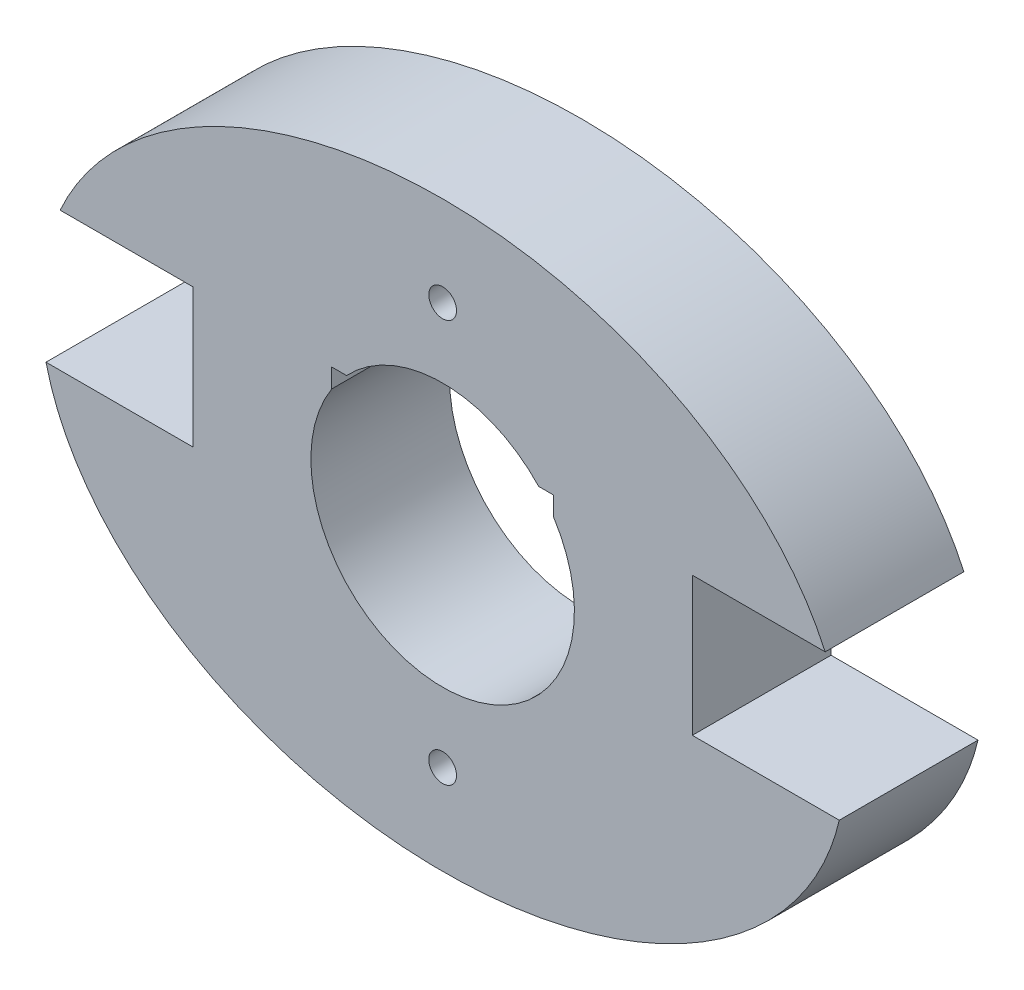
ISO-10303-21;
HEADER;
FILE_DESCRIPTION(('STEP AP214'),'2;1');
FILE_NAME('part.step','',(''),(''),'','','');
FILE_SCHEMA(('AUTOMOTIVE_DESIGN { 1 0 10303 214 1 1 1 1 }'));
ENDSEC;
DATA;
#1=APPLICATION_CONTEXT('core data for automotive mechanical design processes');
#2=APPLICATION_PROTOCOL_DEFINITION('international standard','automotive_design',2000,#1);
#3=PRODUCT_CONTEXT('',#1,'mechanical');
#4=PRODUCT('Part','Part','',(#3));
#5=PRODUCT_RELATED_PRODUCT_CATEGORY('part','',(#4));
#6=PRODUCT_DEFINITION_FORMATION('','',#4);
#7=PRODUCT_DEFINITION_CONTEXT('part definition',#1,'design');
#8=PRODUCT_DEFINITION('design','',#6,#7);
#9=PRODUCT_DEFINITION_SHAPE('','',#8);
#10=(LENGTH_UNIT() NAMED_UNIT(*) SI_UNIT(.MILLI.,.METRE.));
#11=(NAMED_UNIT(*) PLANE_ANGLE_UNIT() SI_UNIT($,.RADIAN.));
#12=(NAMED_UNIT(*) SI_UNIT($,.STERADIAN.) SOLID_ANGLE_UNIT());
#13=UNCERTAINTY_MEASURE_WITH_UNIT(LENGTH_MEASURE(1.E-05),#10,'distance_accuracy_value','');
#14=(GEOMETRIC_REPRESENTATION_CONTEXT(3) GLOBAL_UNCERTAINTY_ASSIGNED_CONTEXT((#13)) GLOBAL_UNIT_ASSIGNED_CONTEXT((#10,
#11,#12)) REPRESENTATION_CONTEXT('',''));
#15=CARTESIAN_POINT('',(0.,0.,0.));
#16=DIRECTION('',(0.,0.,1.));
#17=DIRECTION('',(1.,0.,0.));
#18=AXIS2_PLACEMENT_3D('',#15,#16,#17);
#19=CARTESIAN_POINT('',(0.,0.,5.));
#20=DIRECTION('',(0.,0.,-1.));
#21=DIRECTION('',(-1.,0.,0.));
#22=AXIS2_PLACEMENT_3D('',#19,#20,#21);
#23=CYLINDRICAL_SURFACE('',#22,4.75000000000001);
#24=DIRECTION('',(0.,0.,-1.));
#25=VECTOR('',#24,1.);
#26=CARTESIAN_POINT('',(3.46410161513778,3.25,5.));
#27=LINE('',#26,#25);
#28=CARTESIAN_POINT('',(3.46410161513778,3.25,5.));
#29=VERTEX_POINT('',#28);
#30=CARTESIAN_POINT('',(3.46410161513778,3.25,0.));
#31=VERTEX_POINT('',#30);
#32=EDGE_CURVE('E11',#29,#31,#27,.T.);
#33=ORIENTED_EDGE('',*,*,#32,.F.);
#34=CARTESIAN_POINT('',(0.,0.,5.));
#35=DIRECTION('',(0.,0.,1.));
#36=DIRECTION('',(1.,0.,0.));
#37=AXIS2_PLACEMENT_3D('',#34,#35,#36);
#38=CIRCLE('',#37,4.75000000000001);
#39=CARTESIAN_POINT('',(-3.46410161513778,3.25,5.));
#40=VERTEX_POINT('',#39);
#41=EDGE_CURVE('E156',#29,#40,#38,.T.);
#42=ORIENTED_EDGE('',*,*,#41,.T.);
#43=DIRECTION('',(0.,0.,-1.));
#44=VECTOR('',#43,1.);
#45=CARTESIAN_POINT('',(-3.46410161513778,3.25,5.));
#46=LINE('',#45,#44);
#47=CARTESIAN_POINT('',(-3.46410161513778,3.25,0.));
#48=VERTEX_POINT('',#47);
#49=EDGE_CURVE('E42',#48,#40,#46,.F.);
#50=ORIENTED_EDGE('',*,*,#49,.F.);
#51=CARTESIAN_POINT('',(0.,0.,0.));
#52=DIRECTION('',(0.,0.,1.));
#53=DIRECTION('',(1.,0.,0.));
#54=AXIS2_PLACEMENT_3D('',#51,#52,#53);
#55=CIRCLE('',#54,4.75000000000001);
#56=EDGE_CURVE('E170',#31,#48,#55,.T.);
#57=ORIENTED_EDGE('',*,*,#56,.F.);
#58=EDGE_LOOP('',(#33,#42,#50,#57));
#59=FACE_BOUND('',#58,.T.);
#60=ADVANCED_FACE('F33',(#59),#23,.F.);
#61=CARTESIAN_POINT('',(0.,0.,5.));
#62=DIRECTION('',(0.,0.,-1.));
#63=DIRECTION('',(-1.,0.,0.));
#64=AXIS2_PLACEMENT_3D('',#61,#62,#63);
#65=PLANE('',#64);
#66=CARTESIAN_POINT('',(0.,-7.25449999999413,5.));
#67=DIRECTION('',(0.,0.,1.));
#68=DIRECTION('',(1.,0.,0.));
#69=AXIS2_PLACEMENT_3D('',#66,#67,#68);
#70=CIRCLE('',#69,0.499999999997022);
#71=CARTESIAN_POINT('',(0.499999999997022,-7.25449999999413,5.));
#72=VERTEX_POINT('',#71);
#73=EDGE_CURVE('E173',#72,#72,#70,.T.);
#74=ORIENTED_EDGE('',*,*,#73,.F.);
#75=EDGE_LOOP('',(#74));
#76=FACE_BOUND('',#75,.T.);
#77=CARTESIAN_POINT('',(0.,0.,5.));
#78=DIRECTION('',(0.,0.,1.));
#79=DIRECTION('',(1.,0.,0.));
#80=AXIS2_PLACEMENT_3D('',#77,#78,#79);
#81=ELLIPSE('',#80,14.5,10.5);
#82=CARTESIAN_POINT('',(13.7879295448514,3.25,5.));
#83=VERTEX_POINT('',#82);
#84=CARTESIAN_POINT('',(-13.7879295448514,3.25,5.));
#85=VERTEX_POINT('',#84);
#86=EDGE_CURVE('E185',#83,#85,#81,.T.);
#87=ORIENTED_EDGE('',*,*,#86,.T.);
#88=DIRECTION('',(1.,0.,0.));
#89=VECTOR('',#88,1.);
#90=CARTESIAN_POINT('',(-13.7879295448514,3.25,5.));
#91=LINE('',#90,#89);
#92=CARTESIAN_POINT('',(-9.,3.25,5.));
#93=VERTEX_POINT('',#92);
#94=EDGE_CURVE('E189',#85,#93,#91,.T.);
#95=ORIENTED_EDGE('',*,*,#94,.T.);
#96=DIRECTION('',(0.,-1.,0.));
#97=VECTOR('',#96,1.);
#98=CARTESIAN_POINT('',(-9.,3.25,5.));
#99=LINE('',#98,#97);
#100=CARTESIAN_POINT('',(-9.,-1.75000000000001,5.));
#101=VERTEX_POINT('',#100);
#102=EDGE_CURVE('E192',#93,#101,#99,.T.);
#103=ORIENTED_EDGE('',*,*,#102,.T.);
#104=DIRECTION('',(-1.,0.,0.));
#105=VECTOR('',#104,1.);
#106=CARTESIAN_POINT('',(-14.2971928091574,-1.75000000000001,5.));
#107=LINE('',#106,#105);
#108=CARTESIAN_POINT('',(-14.2971928091574,-1.75000000000001,5.));
#109=VERTEX_POINT('',#108);
#110=EDGE_CURVE('E194',#101,#109,#107,.T.);
#111=ORIENTED_EDGE('',*,*,#110,.T.);
#112=CARTESIAN_POINT('',(0.,0.,5.));
#113=DIRECTION('',(0.,0.,1.));
#114=DIRECTION('',(1.,0.,0.));
#115=AXIS2_PLACEMENT_3D('',#112,#113,#114);
#116=ELLIPSE('',#115,14.5,10.5);
#117=CARTESIAN_POINT('',(14.2971928091574,-1.75000000000001,5.));
#118=VERTEX_POINT('',#117);
#119=EDGE_CURVE('E196',#109,#118,#116,.T.);
#120=ORIENTED_EDGE('',*,*,#119,.T.);
#121=DIRECTION('',(-1.,0.,0.));
#122=VECTOR('',#121,1.);
#123=CARTESIAN_POINT('',(14.2971928091574,-1.75000000000001,5.));
#124=LINE('',#123,#122);
#125=CARTESIAN_POINT('',(9.,-1.75,5.));
#126=VERTEX_POINT('',#125);
#127=EDGE_CURVE('E199',#118,#126,#124,.T.);
#128=ORIENTED_EDGE('',*,*,#127,.T.);
#129=DIRECTION('',(0.,1.,0.));
#130=VECTOR('',#129,1.);
#131=CARTESIAN_POINT('',(9.,3.25,5.));
#132=LINE('',#131,#130);
#133=CARTESIAN_POINT('',(9.,3.25,5.));
#134=VERTEX_POINT('',#133);
#135=EDGE_CURVE('E301',#126,#134,#132,.T.);
#136=ORIENTED_EDGE('',*,*,#135,.T.);
#137=DIRECTION('',(1.,0.,0.));
#138=VECTOR('',#137,1.);
#139=CARTESIAN_POINT('',(13.7879295448514,3.25,5.));
#140=LINE('',#139,#138);
#141=EDGE_CURVE('E285',#134,#83,#140,.T.);
#142=ORIENTED_EDGE('',*,*,#141,.T.);
#143=EDGE_LOOP('',(#87,#95,#103,#111,#120,#128,#136,#142));
#144=FACE_BOUND('',#143,.T.);
#145=CARTESIAN_POINT('',(3.11417199942654E-12,7.25450000000587,5.));
#146=DIRECTION('',(0.,0.,1.));
#147=DIRECTION('',(1.,0.,0.));
#148=AXIS2_PLACEMENT_3D('',#145,#146,#147);
#149=CIRCLE('',#148,0.5);
#150=CARTESIAN_POINT('',(0.500000000003114,7.25450000000587,5.));
#151=VERTEX_POINT('',#150);
#152=EDGE_CURVE('E180',#151,#151,#149,.T.);
#153=ORIENTED_EDGE('',*,*,#152,.F.);
#154=EDGE_LOOP('',(#153));
#155=FACE_BOUND('',#154,.T.);
#156=DIRECTION('',(0.,1.,0.));
#157=VECTOR('',#156,1.);
#158=CARTESIAN_POINT('',(-4.,3.25,5.));
#159=LINE('',#158,#157);
#160=CARTESIAN_POINT('',(-4.,2.56173769148993,5.));
#161=VERTEX_POINT('',#160);
#162=CARTESIAN_POINT('',(-4.,3.25,5.));
#163=VERTEX_POINT('',#162);
#164=EDGE_CURVE('E57',#161,#163,#159,.T.);
#165=ORIENTED_EDGE('',*,*,#164,.T.);
#166=DIRECTION('',(1.,0.,0.));
#167=VECTOR('',#166,1.);
#168=CARTESIAN_POINT('',(-4.,3.25,5.));
#169=LINE('',#168,#167);
#170=EDGE_CURVE('E150',#163,#40,#169,.T.);
#171=ORIENTED_EDGE('',*,*,#170,.T.);
#172=ORIENTED_EDGE('',*,*,#41,.F.);
#173=CARTESIAN_POINT('',(4.,3.25,5.));
#174=VERTEX_POINT('',#173);
#175=EDGE_CURVE('E137',#29,#174,#169,.T.);
#176=ORIENTED_EDGE('',*,*,#175,.T.);
#177=DIRECTION('',(0.,-1.,0.));
#178=VECTOR('',#177,1.);
#179=CARTESIAN_POINT('',(4.,3.25,5.));
#180=LINE('',#179,#178);
#181=CARTESIAN_POINT('',(4.,2.56173769148993,5.));
#182=VERTEX_POINT('',#181);
#183=EDGE_CURVE('E144',#174,#182,#180,.T.);
#184=ORIENTED_EDGE('',*,*,#183,.T.);
#185=EDGE_CURVE('E168',#161,#182,#38,.T.);
#186=ORIENTED_EDGE('',*,*,#185,.F.);
#187=EDGE_LOOP('',(#165,#171,#172,#176,#184,#186));
#188=FACE_BOUND('',#187,.T.);
#189=ADVANCED_FACE('F153',(#76,#144,#155,#188),#65,.F.);
#190=CARTESIAN_POINT('',(0.,0.,0.));
#191=DIRECTION('',(0.,0.,-1.));
#192=DIRECTION('',(-1.,0.,0.));
#193=AXIS2_PLACEMENT_3D('',#190,#191,#192);
#194=PLANE('',#193);
#195=DIRECTION('',(1.,0.,0.));
#196=VECTOR('',#195,1.);
#197=CARTESIAN_POINT('',(-4.,3.25,0.));
#198=LINE('',#197,#196);
#199=CARTESIAN_POINT('',(-4.,3.25,0.));
#200=VERTEX_POINT('',#199);
#201=EDGE_CURVE('E162',#200,#48,#198,.T.);
#202=ORIENTED_EDGE('',*,*,#201,.F.);
#203=DIRECTION('',(0.,1.,0.));
#204=VECTOR('',#203,1.);
#205=CARTESIAN_POINT('',(-4.,3.25,0.));
#206=LINE('',#205,#204);
#207=CARTESIAN_POINT('',(-4.,2.56173769148993,0.));
#208=VERTEX_POINT('',#207);
#209=EDGE_CURVE('E157',#208,#200,#206,.T.);
#210=ORIENTED_EDGE('',*,*,#209,.F.);
#211=CARTESIAN_POINT('',(4.,2.56173769148993,0.));
#212=VERTEX_POINT('',#211);
#213=EDGE_CURVE('E166',#208,#212,#55,.T.);
#214=ORIENTED_EDGE('',*,*,#213,.T.);
#215=DIRECTION('',(0.,-1.,0.));
#216=VECTOR('',#215,1.);
#217=CARTESIAN_POINT('',(4.,3.25,0.));
#218=LINE('',#217,#216);
#219=CARTESIAN_POINT('',(4.,3.25,0.));
#220=VERTEX_POINT('',#219);
#221=EDGE_CURVE('E49',#220,#212,#218,.T.);
#222=ORIENTED_EDGE('',*,*,#221,.F.);
#223=EDGE_CURVE('E140',#31,#220,#198,.T.);
#224=ORIENTED_EDGE('',*,*,#223,.F.);
#225=ORIENTED_EDGE('',*,*,#56,.T.);
#226=EDGE_LOOP('',(#202,#210,#214,#222,#224,#225));
#227=FACE_BOUND('',#226,.T.);
#228=CARTESIAN_POINT('',(0.,-7.25449999999413,0.));
#229=DIRECTION('',(0.,0.,1.));
#230=DIRECTION('',(1.,0.,0.));
#231=AXIS2_PLACEMENT_3D('',#228,#229,#230);
#232=CIRCLE('',#231,0.499999999997022);
#233=CARTESIAN_POINT('',(0.499999999997022,-7.25449999999413,0.));
#234=VERTEX_POINT('',#233);
#235=EDGE_CURVE('E177',#234,#234,#232,.T.);
#236=ORIENTED_EDGE('',*,*,#235,.T.);
#237=EDGE_LOOP('',(#236));
#238=FACE_BOUND('',#237,.T.);
#239=CARTESIAN_POINT('',(0.,0.,0.));
#240=DIRECTION('',(0.,0.,1.));
#241=DIRECTION('',(1.,0.,0.));
#242=AXIS2_PLACEMENT_3D('',#239,#240,#241);
#243=ELLIPSE('',#242,14.5,10.5);
#244=CARTESIAN_POINT('',(13.7879295448514,3.25,0.));
#245=VERTEX_POINT('',#244);
#246=CARTESIAN_POINT('',(-13.7879295448514,3.25,0.));
#247=VERTEX_POINT('',#246);
#248=EDGE_CURVE('E183',#245,#247,#243,.T.);
#249=ORIENTED_EDGE('',*,*,#248,.F.);
#250=DIRECTION('',(1.,0.,0.));
#251=VECTOR('',#250,1.);
#252=CARTESIAN_POINT('',(13.7879295448514,3.25,0.));
#253=LINE('',#252,#251);
#254=CARTESIAN_POINT('',(9.,3.25,0.));
#255=VERTEX_POINT('',#254);
#256=EDGE_CURVE('E190',#255,#245,#253,.T.);
#257=ORIENTED_EDGE('',*,*,#256,.F.);
#258=DIRECTION('',(0.,1.,0.));
#259=VECTOR('',#258,1.);
#260=CARTESIAN_POINT('',(9.,3.25,0.));
#261=LINE('',#260,#259);
#262=CARTESIAN_POINT('',(9.,-1.75,0.));
#263=VERTEX_POINT('',#262);
#264=EDGE_CURVE('E287',#263,#255,#261,.T.);
#265=ORIENTED_EDGE('',*,*,#264,.F.);
#266=DIRECTION('',(-1.,0.,0.));
#267=VECTOR('',#266,1.);
#268=CARTESIAN_POINT('',(14.2971928091574,-1.75000000000001,0.));
#269=LINE('',#268,#267);
#270=CARTESIAN_POINT('',(14.2971928091574,-1.75000000000001,0.));
#271=VERTEX_POINT('',#270);
#272=EDGE_CURVE('E289',#271,#263,#269,.T.);
#273=ORIENTED_EDGE('',*,*,#272,.F.);
#274=CARTESIAN_POINT('',(0.,0.,0.));
#275=DIRECTION('',(0.,0.,1.));
#276=DIRECTION('',(1.,0.,0.));
#277=AXIS2_PLACEMENT_3D('',#274,#275,#276);
#278=ELLIPSE('',#277,14.5,10.5);
#279=CARTESIAN_POINT('',(-14.2971928091574,-1.75000000000001,0.));
#280=VERTEX_POINT('',#279);
#281=EDGE_CURVE('E291',#280,#271,#278,.T.);
#282=ORIENTED_EDGE('',*,*,#281,.F.);
#283=DIRECTION('',(-1.,0.,0.));
#284=VECTOR('',#283,1.);
#285=CARTESIAN_POINT('',(-14.2971928091574,-1.75000000000001,0.));
#286=LINE('',#285,#284);
#287=CARTESIAN_POINT('',(-9.,-1.75000000000001,0.));
#288=VERTEX_POINT('',#287);
#289=EDGE_CURVE('E293',#288,#280,#286,.T.);
#290=ORIENTED_EDGE('',*,*,#289,.F.);
#291=DIRECTION('',(0.,-1.,0.));
#292=VECTOR('',#291,1.);
#293=CARTESIAN_POINT('',(-9.,3.25,0.));
#294=LINE('',#293,#292);
#295=CARTESIAN_POINT('',(-9.,3.25,0.));
#296=VERTEX_POINT('',#295);
#297=EDGE_CURVE('E295',#296,#288,#294,.T.);
#298=ORIENTED_EDGE('',*,*,#297,.F.);
#299=DIRECTION('',(1.,0.,0.));
#300=VECTOR('',#299,1.);
#301=CARTESIAN_POINT('',(-13.7879295448514,3.25,0.));
#302=LINE('',#301,#300);
#303=EDGE_CURVE('E297',#247,#296,#302,.T.);
#304=ORIENTED_EDGE('',*,*,#303,.F.);
#305=EDGE_LOOP('',(#249,#257,#265,#273,#282,#290,#298,#304));
#306=FACE_BOUND('',#305,.T.);
#307=CARTESIAN_POINT('',(3.11417199942654E-12,7.25450000000587,0.));
#308=DIRECTION('',(0.,0.,1.));
#309=DIRECTION('',(1.,0.,0.));
#310=AXIS2_PLACEMENT_3D('',#307,#308,#309);
#311=CIRCLE('',#310,0.5);
#312=CARTESIAN_POINT('',(0.500000000003114,7.25450000000587,0.));
#313=VERTEX_POINT('',#312);
#314=EDGE_CURVE('E176',#313,#313,#311,.T.);
#315=ORIENTED_EDGE('',*,*,#314,.T.);
#316=EDGE_LOOP('',(#315));
#317=FACE_BOUND('',#316,.T.);
#318=ADVANCED_FACE('F222',(#227,#238,#306,#317),#194,.T.);
#319=DIRECTION('',(0.,0.,-1.));
#320=VECTOR('',#319,1.);
#321=SURFACE_OF_LINEAR_EXTRUSION('',#81,#320);
#322=ORIENTED_EDGE('',*,*,#248,.T.);
#323=DIRECTION('',(0.,0.,-1.));
#324=VECTOR('',#323,1.);
#325=CARTESIAN_POINT('',(-13.7879295448514,3.25,5.));
#326=LINE('',#325,#324);
#327=EDGE_CURVE('E261',#85,#247,#326,.T.);
#328=ORIENTED_EDGE('',*,*,#327,.F.);
#329=ORIENTED_EDGE('',*,*,#86,.F.);
#330=DIRECTION('',(0.,0.,-1.));
#331=VECTOR('',#330,1.);
#332=CARTESIAN_POINT('',(13.7879295448514,3.25,5.));
#333=LINE('',#332,#331);
#334=EDGE_CURVE('E282',#83,#245,#333,.T.);
#335=ORIENTED_EDGE('',*,*,#334,.T.);
#336=EDGE_LOOP('',(#322,#328,#329,#335));
#337=FACE_BOUND('',#336,.T.);
#338=ADVANCED_FACE('F35',(#337),#321,.F.);
#339=CARTESIAN_POINT('',(-13.7879295448514,3.25,5.));
#340=DIRECTION('',(0.,1.,0.));
#341=DIRECTION('',(-1.,0.,0.));
#342=AXIS2_PLACEMENT_3D('',#339,#340,#341);
#343=PLANE('',#342);
#344=ORIENTED_EDGE('',*,*,#303,.T.);
#345=DIRECTION('',(0.,0.,-1.));
#346=VECTOR('',#345,1.);
#347=CARTESIAN_POINT('',(-9.,3.25,5.));
#348=LINE('',#347,#346);
#349=EDGE_CURVE('E264',#93,#296,#348,.T.);
#350=ORIENTED_EDGE('',*,*,#349,.F.);
#351=ORIENTED_EDGE('',*,*,#94,.F.);
#352=ORIENTED_EDGE('',*,*,#327,.T.);
#353=EDGE_LOOP('',(#344,#350,#351,#352));
#354=FACE_BOUND('',#353,.T.);
#355=ADVANCED_FACE('F215',(#354),#343,.F.);
#356=CARTESIAN_POINT('',(-9.,3.25,5.));
#357=DIRECTION('',(1.,0.,0.));
#358=DIRECTION('',(0.,1.,0.));
#359=AXIS2_PLACEMENT_3D('',#356,#357,#358);
#360=PLANE('',#359);
#361=ORIENTED_EDGE('',*,*,#297,.T.);
#362=DIRECTION('',(0.,0.,-1.));
#363=VECTOR('',#362,1.);
#364=CARTESIAN_POINT('',(-9.,-1.75000000000001,5.));
#365=LINE('',#364,#363);
#366=EDGE_CURVE('E267',#101,#288,#365,.T.);
#367=ORIENTED_EDGE('',*,*,#366,.F.);
#368=ORIENTED_EDGE('',*,*,#102,.F.);
#369=ORIENTED_EDGE('',*,*,#349,.T.);
#370=EDGE_LOOP('',(#361,#367,#368,#369));
#371=FACE_BOUND('',#370,.T.);
#372=ADVANCED_FACE('F212',(#371),#360,.F.);
#373=CARTESIAN_POINT('',(-14.2971928091574,-1.75000000000001,5.));
#374=DIRECTION('',(0.,-1.,0.));
#375=DIRECTION('',(1.,0.,0.));
#376=AXIS2_PLACEMENT_3D('',#373,#374,#375);
#377=PLANE('',#376);
#378=ORIENTED_EDGE('',*,*,#289,.T.);
#379=DIRECTION('',(0.,0.,-1.));
#380=VECTOR('',#379,1.);
#381=CARTESIAN_POINT('',(-14.2971928091574,-1.75000000000001,5.));
#382=LINE('',#381,#380);
#383=EDGE_CURVE('E270',#109,#280,#382,.T.);
#384=ORIENTED_EDGE('',*,*,#383,.F.);
#385=ORIENTED_EDGE('',*,*,#110,.F.);
#386=ORIENTED_EDGE('',*,*,#366,.T.);
#387=EDGE_LOOP('',(#378,#384,#385,#386));
#388=FACE_BOUND('',#387,.T.);
#389=ADVANCED_FACE('F207',(#388),#377,.F.);
#390=DIRECTION('',(0.,0.,-1.));
#391=VECTOR('',#390,1.);
#392=SURFACE_OF_LINEAR_EXTRUSION('',#116,#391);
#393=ORIENTED_EDGE('',*,*,#281,.T.);
#394=DIRECTION('',(0.,0.,-1.));
#395=VECTOR('',#394,1.);
#396=CARTESIAN_POINT('',(14.2971928091574,-1.75000000000001,5.));
#397=LINE('',#396,#395);
#398=EDGE_CURVE('E273',#118,#271,#397,.T.);
#399=ORIENTED_EDGE('',*,*,#398,.F.);
#400=ORIENTED_EDGE('',*,*,#119,.F.);
#401=ORIENTED_EDGE('',*,*,#383,.T.);
#402=EDGE_LOOP('',(#393,#399,#400,#401));
#403=FACE_BOUND('',#402,.T.);
#404=ADVANCED_FACE('F202',(#403),#392,.F.);
#405=CARTESIAN_POINT('',(14.2971928091574,-1.75000000000001,5.));
#406=DIRECTION('',(0.,-1.,0.));
#407=DIRECTION('',(1.,0.,0.));
#408=AXIS2_PLACEMENT_3D('',#405,#406,#407);
#409=PLANE('',#408);
#410=ORIENTED_EDGE('',*,*,#272,.T.);
#411=DIRECTION('',(0.,0.,-1.));
#412=VECTOR('',#411,1.);
#413=CARTESIAN_POINT('',(9.,-1.75,5.));
#414=LINE('',#413,#412);
#415=EDGE_CURVE('E276',#126,#263,#414,.T.);
#416=ORIENTED_EDGE('',*,*,#415,.F.);
#417=ORIENTED_EDGE('',*,*,#127,.F.);
#418=ORIENTED_EDGE('',*,*,#398,.T.);
#419=EDGE_LOOP('',(#410,#416,#417,#418));
#420=FACE_BOUND('',#419,.T.);
#421=ADVANCED_FACE('F206',(#420),#409,.F.);
#422=CARTESIAN_POINT('',(9.,3.25,5.));
#423=DIRECTION('',(-1.,0.,0.));
#424=DIRECTION('',(0.,-1.,0.));
#425=AXIS2_PLACEMENT_3D('',#422,#423,#424);
#426=PLANE('',#425);
#427=ORIENTED_EDGE('',*,*,#264,.T.);
#428=DIRECTION('',(0.,0.,-1.));
#429=VECTOR('',#428,1.);
#430=CARTESIAN_POINT('',(9.,3.25,5.));
#431=LINE('',#430,#429);
#432=EDGE_CURVE('E279',#134,#255,#431,.T.);
#433=ORIENTED_EDGE('',*,*,#432,.F.);
#434=ORIENTED_EDGE('',*,*,#135,.F.);
#435=ORIENTED_EDGE('',*,*,#415,.T.);
#436=EDGE_LOOP('',(#427,#433,#434,#435));
#437=FACE_BOUND('',#436,.T.);
#438=ADVANCED_FACE('F314',(#437),#426,.F.);
#439=CARTESIAN_POINT('',(13.7879295448514,3.25,5.));
#440=DIRECTION('',(0.,1.,0.));
#441=DIRECTION('',(-1.,0.,0.));
#442=AXIS2_PLACEMENT_3D('',#439,#440,#441);
#443=PLANE('',#442);
#444=ORIENTED_EDGE('',*,*,#256,.T.);
#445=ORIENTED_EDGE('',*,*,#334,.F.);
#446=ORIENTED_EDGE('',*,*,#141,.F.);
#447=ORIENTED_EDGE('',*,*,#432,.T.);
#448=EDGE_LOOP('',(#444,#445,#446,#447));
#449=FACE_BOUND('',#448,.T.);
#450=ADVANCED_FACE('F319',(#449),#443,.F.);
#451=CARTESIAN_POINT('',(3.11417199942654E-12,7.25450000000587,5.));
#452=DIRECTION('',(0.,0.,-1.));
#453=DIRECTION('',(-1.,0.,0.));
#454=AXIS2_PLACEMENT_3D('',#451,#452,#453);
#455=CYLINDRICAL_SURFACE('',#454,0.5);
#456=ORIENTED_EDGE('',*,*,#152,.T.);
#457=EDGE_LOOP('',(#456));
#458=FACE_BOUND('',#457,.T.);
#459=ORIENTED_EDGE('',*,*,#314,.F.);
#460=EDGE_LOOP('',(#459));
#461=FACE_BOUND('',#460,.T.);
#462=ADVANCED_FACE('F243',(#458,#461),#455,.F.);
#463=CARTESIAN_POINT('',(0.,-7.25449999999413,5.));
#464=DIRECTION('',(0.,0.,-1.));
#465=DIRECTION('',(-1.,0.,0.));
#466=AXIS2_PLACEMENT_3D('',#463,#464,#465);
#467=CYLINDRICAL_SURFACE('',#466,0.499999999997022);
#468=ORIENTED_EDGE('',*,*,#73,.T.);
#469=EDGE_LOOP('',(#468));
#470=FACE_BOUND('',#469,.T.);
#471=ORIENTED_EDGE('',*,*,#235,.F.);
#472=EDGE_LOOP('',(#471));
#473=FACE_BOUND('',#472,.T.);
#474=ADVANCED_FACE('F236',(#470,#473),#467,.F.);
#475=DIRECTION('',(0.,0.,-1.));
#476=VECTOR('',#475,1.);
#477=CARTESIAN_POINT('',(-4.,2.56173769148993,5.));
#478=LINE('',#477,#476);
#479=EDGE_CURVE('E246',#161,#208,#478,.T.);
#480=ORIENTED_EDGE('',*,*,#479,.F.);
#481=ORIENTED_EDGE('',*,*,#185,.T.);
#482=DIRECTION('',(0.,0.,-1.));
#483=VECTOR('',#482,1.);
#484=CARTESIAN_POINT('',(4.,2.56173769148993,5.));
#485=LINE('',#484,#483);
#486=EDGE_CURVE('E146',#212,#182,#485,.F.);
#487=ORIENTED_EDGE('',*,*,#486,.F.);
#488=ORIENTED_EDGE('',*,*,#213,.F.);
#489=EDGE_LOOP('',(#480,#481,#487,#488));
#490=FACE_BOUND('',#489,.T.);
#491=ADVANCED_FACE('F227',(#490),#23,.F.);
#492=CARTESIAN_POINT('',(4.,3.25,5.));
#493=DIRECTION('',(1.,0.,0.));
#494=DIRECTION('',(0.,0.,-1.));
#495=AXIS2_PLACEMENT_3D('',#492,#493,#494);
#496=PLANE('',#495);
#497=ORIENTED_EDGE('',*,*,#486,.T.);
#498=ORIENTED_EDGE('',*,*,#183,.F.);
#499=DIRECTION('',(0.,0.,-1.));
#500=VECTOR('',#499,1.);
#501=CARTESIAN_POINT('',(4.,3.25,5.));
#502=LINE('',#501,#500);
#503=EDGE_CURVE('E133',#174,#220,#502,.T.);
#504=ORIENTED_EDGE('',*,*,#503,.T.);
#505=ORIENTED_EDGE('',*,*,#221,.T.);
#506=EDGE_LOOP('',(#497,#498,#504,#505));
#507=FACE_BOUND('',#506,.T.);
#508=ADVANCED_FACE('F145',(#507),#496,.F.);
#509=CARTESIAN_POINT('',(-4.,3.25,5.));
#510=DIRECTION('',(0.,1.,0.));
#511=DIRECTION('',(0.,0.,1.));
#512=AXIS2_PLACEMENT_3D('',#509,#510,#511);
#513=PLANE('',#512);
#514=ORIENTED_EDGE('',*,*,#32,.T.);
#515=ORIENTED_EDGE('',*,*,#223,.T.);
#516=ORIENTED_EDGE('',*,*,#503,.F.);
#517=ORIENTED_EDGE('',*,*,#175,.F.);
#518=EDGE_LOOP('',(#514,#515,#516,#517));
#519=FACE_BOUND('',#518,.T.);
#520=ADVANCED_FACE('F135',(#519),#513,.F.);
#521=ORIENTED_EDGE('',*,*,#49,.T.);
#522=ORIENTED_EDGE('',*,*,#170,.F.);
#523=DIRECTION('',(0.,0.,-1.));
#524=VECTOR('',#523,1.);
#525=CARTESIAN_POINT('',(-4.,3.25,5.));
#526=LINE('',#525,#524);
#527=EDGE_CURVE('E141',#163,#200,#526,.T.);
#528=ORIENTED_EDGE('',*,*,#527,.T.);
#529=ORIENTED_EDGE('',*,*,#201,.T.);
#530=EDGE_LOOP('',(#521,#522,#528,#529));
#531=FACE_BOUND('',#530,.T.);
#532=ADVANCED_FACE('F258',(#531),#513,.F.);
#533=CARTESIAN_POINT('',(-4.,3.25,5.));
#534=DIRECTION('',(-1.,0.,0.));
#535=DIRECTION('',(0.,0.,1.));
#536=AXIS2_PLACEMENT_3D('',#533,#534,#535);
#537=PLANE('',#536);
#538=ORIENTED_EDGE('',*,*,#479,.T.);
#539=ORIENTED_EDGE('',*,*,#209,.T.);
#540=ORIENTED_EDGE('',*,*,#527,.F.);
#541=ORIENTED_EDGE('',*,*,#164,.F.);
#542=EDGE_LOOP('',(#538,#539,#540,#541));
#543=FACE_BOUND('',#542,.T.);
#544=ADVANCED_FACE('F257',(#543),#537,.F.);
#545=CLOSED_SHELL('',(#60,#189,#318,#338,#355,#372,#389,#404,#421,#438,#450,#462,#474,#491,#508,
#520,#532,#544));
#546=MANIFOLD_SOLID_BREP('B2',#545);
#547=ADVANCED_BREP_SHAPE_REPRESENTATION('',(#18,#546),#14);
#548=SHAPE_DEFINITION_REPRESENTATION(#9,#547);
ENDSEC;
END-ISO-10303-21;
